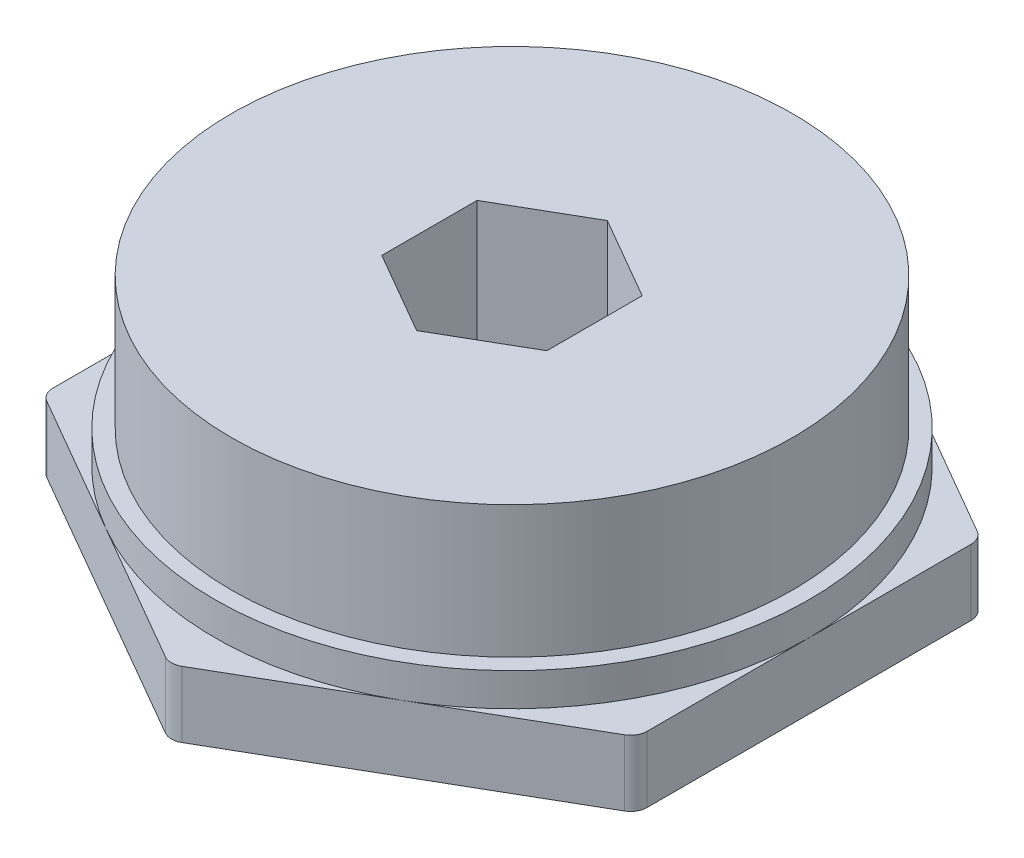
ISO-10303-21;
HEADER;
FILE_DESCRIPTION(('STEP AP214'),'2;1');
FILE_NAME('part.step','',(''),(''),'','','');
FILE_SCHEMA(('AUTOMOTIVE_DESIGN { 1 0 10303 214 1 1 1 1 }'));
ENDSEC;
DATA;
#1=APPLICATION_CONTEXT('core data for automotive mechanical design processes');
#2=APPLICATION_PROTOCOL_DEFINITION('international standard','automotive_design',2000,#1);
#3=PRODUCT_CONTEXT('',#1,'mechanical');
#4=PRODUCT('Part','Part','',(#3));
#5=PRODUCT_RELATED_PRODUCT_CATEGORY('part','',(#4));
#6=PRODUCT_DEFINITION_FORMATION('','',#4);
#7=PRODUCT_DEFINITION_CONTEXT('part definition',#1,'design');
#8=PRODUCT_DEFINITION('design','',#6,#7);
#9=PRODUCT_DEFINITION_SHAPE('','',#8);
#10=(LENGTH_UNIT() NAMED_UNIT(*) SI_UNIT(.MILLI.,.METRE.));
#11=(NAMED_UNIT(*) PLANE_ANGLE_UNIT() SI_UNIT($,.RADIAN.));
#12=(NAMED_UNIT(*) SI_UNIT($,.STERADIAN.) SOLID_ANGLE_UNIT());
#13=UNCERTAINTY_MEASURE_WITH_UNIT(LENGTH_MEASURE(1.E-05),#10,'distance_accuracy_value','');
#14=(GEOMETRIC_REPRESENTATION_CONTEXT(3) GLOBAL_UNCERTAINTY_ASSIGNED_CONTEXT((#13)) GLOBAL_UNIT_ASSIGNED_CONTEXT((#10,
#11,#12)) REPRESENTATION_CONTEXT('',''));
#15=CARTESIAN_POINT('',(0.,0.,0.));
#16=DIRECTION('',(0.,0.,1.));
#17=DIRECTION('',(1.,0.,0.));
#18=AXIS2_PLACEMENT_3D('',#15,#16,#17);
#19=CARTESIAN_POINT('',(0.,33.,0.));
#20=DIRECTION('',(0.,1.,0.));
#21=DIRECTION('',(0.,0.,1.));
#22=AXIS2_PLACEMENT_3D('',#19,#20,#21);
#23=PLANE('',#22);
#24=CARTESIAN_POINT('',(0.,33.,0.));
#25=DIRECTION('',(0.,1.,0.));
#26=DIRECTION('',(0.,0.,1.));
#27=AXIS2_PLACEMENT_3D('',#24,#25,#26);
#28=CIRCLE('',#27,9.00000000000006);
#29=CARTESIAN_POINT('',(4.50000000000009,33.,7.79422863405996));
#30=VERTEX_POINT('',#29);
#31=CARTESIAN_POINT('',(8.99999999999999,33.,0.));
#32=VERTEX_POINT('',#31);
#33=EDGE_CURVE('E303',#30,#32,#28,.T.);
#34=ORIENTED_EDGE('',*,*,#33,.F.);
#35=DIRECTION('',(0.866025403784435,0.,-0.500000000000007));
#36=VECTOR('',#35,1.);
#37=CARTESIAN_POINT('',(0.,33.,10.3923048454133));
#38=LINE('',#37,#36);
#39=CARTESIAN_POINT('',(8.75000000000004,33.,5.34048999000395));
#40=VERTEX_POINT('',#39);
#41=EDGE_CURVE('E334',#30,#40,#38,.T.);
#42=ORIENTED_EDGE('',*,*,#41,.T.);
#43=CARTESIAN_POINT('',(8.50000000000004,33.,4.90747728811174));
#44=DIRECTION('',(0.,1.,0.));
#45=DIRECTION('',(0.,0.,1.));
#46=AXIS2_PLACEMENT_3D('',#43,#44,#45);
#47=CIRCLE('',#46,0.5);
#48=CARTESIAN_POINT('',(9.00000000000004,33.,4.90747728811173));
#49=VERTEX_POINT('',#48);
#50=EDGE_CURVE('E402',#40,#49,#47,.T.);
#51=ORIENTED_EDGE('',*,*,#50,.T.);
#52=DIRECTION('',(0.,0.,-1.));
#53=VECTOR('',#52,1.);
#54=CARTESIAN_POINT('',(9.00000000000004,33.,5.19615242270655));
#55=LINE('',#54,#53);
#56=EDGE_CURVE('E339',#49,#32,#55,.T.);
#57=ORIENTED_EDGE('',*,*,#56,.T.);
#58=EDGE_LOOP('',(#34,#42,#51,#57));
#59=FACE_BOUND('',#58,.T.);
#60=ADVANCED_FACE('F45',(#59),#23,.T.);
#61=CARTESIAN_POINT('',(4.49999999999997,33.,-7.79422863406));
#62=VERTEX_POINT('',#61);
#63=EDGE_CURVE('E55',#32,#62,#28,.T.);
#64=ORIENTED_EDGE('',*,*,#63,.F.);
#65=CARTESIAN_POINT('',(8.99999999999994,33.,-4.90747728811192));
#66=VERTEX_POINT('',#65);
#67=EDGE_CURVE('E338',#32,#66,#55,.T.);
#68=ORIENTED_EDGE('',*,*,#67,.T.);
#69=CARTESIAN_POINT('',(8.49999999999994,33.,-4.90747728811192));
#70=DIRECTION('',(0.,1.,0.));
#71=DIRECTION('',(0.,0.,1.));
#72=AXIS2_PLACEMENT_3D('',#69,#70,#71);
#73=CIRCLE('',#72,0.5);
#74=CARTESIAN_POINT('',(8.74999999999993,33.,-5.34048999000414));
#75=VERTEX_POINT('',#74);
#76=EDGE_CURVE('E399',#66,#75,#73,.T.);
#77=ORIENTED_EDGE('',*,*,#76,.T.);
#78=DIRECTION('',(-0.866025403784441,0.,-0.499999999999995));
#79=VECTOR('',#78,1.);
#80=CARTESIAN_POINT('',(8.99999999999993,33.,-5.19615242270673));
#81=LINE('',#80,#79);
#82=EDGE_CURVE('E314',#75,#62,#81,.T.);
#83=ORIENTED_EDGE('',*,*,#82,.T.);
#84=EDGE_LOOP('',(#64,#68,#77,#83));
#85=FACE_BOUND('',#84,.T.);
#86=ADVANCED_FACE('F471',(#85),#23,.T.);
#87=CARTESIAN_POINT('',(-4.50000000000001,33.,-7.79422863405994));
#88=VERTEX_POINT('',#87);
#89=EDGE_CURVE('E463',#62,#88,#28,.T.);
#90=ORIENTED_EDGE('',*,*,#89,.F.);
#91=CARTESIAN_POINT('',(0.25,33.,-10.2479672781159));
#92=VERTEX_POINT('',#91);
#93=EDGE_CURVE('E319',#62,#92,#81,.T.);
#94=ORIENTED_EDGE('',*,*,#93,.T.);
#95=CARTESIAN_POINT('',(0.,33.,-9.81495457622364));
#96=DIRECTION('',(0.,1.,0.));
#97=DIRECTION('',(0.,0.,1.));
#98=AXIS2_PLACEMENT_3D('',#95,#96,#97);
#99=CIRCLE('',#98,0.5);
#100=CARTESIAN_POINT('',(-0.249999999999997,33.,-10.2479672781159));
#101=VERTEX_POINT('',#100);
#102=EDGE_CURVE('E414',#92,#101,#99,.T.);
#103=ORIENTED_EDGE('',*,*,#102,.T.);
#104=DIRECTION('',(-0.866025403784438,0.,0.500000000000001));
#105=VECTOR('',#104,1.);
#106=CARTESIAN_POINT('',(0.,33.,-10.3923048454133));
#107=LINE('',#106,#105);
#108=EDGE_CURVE('E320',#101,#88,#107,.T.);
#109=ORIENTED_EDGE('',*,*,#108,.T.);
#110=EDGE_LOOP('',(#90,#94,#103,#109));
#111=FACE_BOUND('',#110,.T.);
#112=ADVANCED_FACE('F539',(#111),#23,.T.);
#113=CARTESIAN_POINT('',(-8.99999999999999,33.,0.));
#114=VERTEX_POINT('',#113);
#115=EDGE_CURVE('E459',#88,#114,#28,.T.);
#116=ORIENTED_EDGE('',*,*,#115,.F.);
#117=CARTESIAN_POINT('',(-8.75000000000001,33.,-5.34048999000402));
#118=VERTEX_POINT('',#117);
#119=EDGE_CURVE('E318',#88,#118,#107,.T.);
#120=ORIENTED_EDGE('',*,*,#119,.T.);
#121=CARTESIAN_POINT('',(-8.50000000000001,33.,-4.9074772881118));
#122=DIRECTION('',(0.,1.,0.));
#123=DIRECTION('',(0.,0.,1.));
#124=AXIS2_PLACEMENT_3D('',#121,#122,#123);
#125=CIRCLE('',#124,0.5);
#126=CARTESIAN_POINT('',(-9.00000000000001,33.,-4.90747728811179));
#127=VERTEX_POINT('',#126);
#128=EDGE_CURVE('E411',#118,#127,#125,.T.);
#129=ORIENTED_EDGE('',*,*,#128,.T.);
#130=DIRECTION('',(0.,0.,1.));
#131=VECTOR('',#130,1.);
#132=CARTESIAN_POINT('',(-9.00000000000001,33.,-5.19615242270661));
#133=LINE('',#132,#131);
#134=EDGE_CURVE('E325',#127,#114,#133,.T.);
#135=ORIENTED_EDGE('',*,*,#134,.T.);
#136=EDGE_LOOP('',(#116,#120,#129,#135));
#137=FACE_BOUND('',#136,.T.);
#138=ADVANCED_FACE('F552',(#137),#23,.T.);
#139=CARTESIAN_POINT('',(-4.49999999999995,33.,7.79422863405997));
#140=VERTEX_POINT('',#139);
#141=EDGE_CURVE('E454',#114,#140,#28,.T.);
#142=ORIENTED_EDGE('',*,*,#141,.F.);
#143=CARTESIAN_POINT('',(-8.99999999999998,33.,4.90747728811186));
#144=VERTEX_POINT('',#143);
#145=EDGE_CURVE('E324',#114,#144,#133,.T.);
#146=ORIENTED_EDGE('',*,*,#145,.T.);
#147=CARTESIAN_POINT('',(-8.49999999999998,33.,4.90747728811186));
#148=DIRECTION('',(0.,1.,0.));
#149=DIRECTION('',(0.,0.,1.));
#150=AXIS2_PLACEMENT_3D('',#147,#148,#149);
#151=CIRCLE('',#150,0.5);
#152=CARTESIAN_POINT('',(-8.74999999999997,33.,5.34048999000408));
#153=VERTEX_POINT('',#152);
#154=EDGE_CURVE('E408',#144,#153,#151,.T.);
#155=ORIENTED_EDGE('',*,*,#154,.T.);
#156=DIRECTION('',(0.866025403784442,0.,0.499999999999995));
#157=VECTOR('',#156,1.);
#158=CARTESIAN_POINT('',(-8.99999999999997,33.,5.19615242270667));
#159=LINE('',#158,#157);
#160=EDGE_CURVE('E330',#153,#140,#159,.T.);
#161=ORIENTED_EDGE('',*,*,#160,.T.);
#162=EDGE_LOOP('',(#142,#146,#155,#161));
#163=FACE_BOUND('',#162,.T.);
#164=ADVANCED_FACE('F543',(#163),#23,.T.);
#165=CARTESIAN_POINT('',(8.99999999999993,33.,-5.19615242270673));
#166=DIRECTION('',(-0.499999999999995,0.,0.866025403784441));
#167=DIRECTION('',(0.866025403784442,0.,0.499999999999995));
#168=AXIS2_PLACEMENT_3D('',#165,#166,#167);
#169=PLANE('',#168);
#170=DIRECTION('',(-0.866025403784441,0.,-0.499999999999995));
#171=VECTOR('',#170,1.);
#172=CARTESIAN_POINT('',(8.99999999999993,31.,-5.19615242270673));
#173=LINE('',#172,#171);
#174=CARTESIAN_POINT('',(8.74999999999993,31.,-5.34048999000414));
#175=VERTEX_POINT('',#174);
#176=CARTESIAN_POINT('',(0.25,31.,-10.2479672781159));
#177=VERTEX_POINT('',#176);
#178=EDGE_CURVE('E309',#175,#177,#173,.T.);
#179=ORIENTED_EDGE('',*,*,#178,.T.);
#180=DIRECTION('',(0.,-1.,0.));
#181=VECTOR('',#180,1.);
#182=CARTESIAN_POINT('',(0.25,33.,-10.2479672781159));
#183=LINE('',#182,#181);
#184=EDGE_CURVE('E395',#177,#92,#183,.F.);
#185=ORIENTED_EDGE('',*,*,#184,.T.);
#186=ORIENTED_EDGE('',*,*,#93,.F.);
#187=ORIENTED_EDGE('',*,*,#82,.F.);
#188=DIRECTION('',(0.,-1.,0.));
#189=VECTOR('',#188,1.);
#190=CARTESIAN_POINT('',(8.74999999999993,33.,-5.34048999000414));
#191=LINE('',#190,#189);
#192=EDGE_CURVE('E391',#75,#175,#191,.T.);
#193=ORIENTED_EDGE('',*,*,#192,.T.);
#194=EDGE_LOOP('',(#179,#185,#186,#187,#193));
#195=FACE_BOUND('',#194,.T.);
#196=ADVANCED_FACE('F521',(#195),#169,.F.);
#197=CARTESIAN_POINT('',(0.,33.,-10.3923048454133));
#198=DIRECTION('',(0.500000000000001,0.,0.866025403784438));
#199=DIRECTION('',(0.866025403784438,0.,-0.500000000000001));
#200=AXIS2_PLACEMENT_3D('',#197,#198,#199);
#201=PLANE('',#200);
#202=ORIENTED_EDGE('',*,*,#108,.F.);
#203=DIRECTION('',(0.,-1.,0.));
#204=VECTOR('',#203,1.);
#205=CARTESIAN_POINT('',(-0.249999999999997,33.,-10.2479672781159));
#206=LINE('',#205,#204);
#207=CARTESIAN_POINT('',(-0.249999999999997,31.,-10.2479672781159));
#208=VERTEX_POINT('',#207);
#209=EDGE_CURVE('E370',#101,#208,#206,.T.);
#210=ORIENTED_EDGE('',*,*,#209,.T.);
#211=DIRECTION('',(-0.866025403784438,0.,0.500000000000001));
#212=VECTOR('',#211,1.);
#213=CARTESIAN_POINT('',(0.,31.,-10.3923048454133));
#214=LINE('',#213,#212);
#215=CARTESIAN_POINT('',(-8.75000000000001,31.,-5.34048999000402));
#216=VERTEX_POINT('',#215);
#217=EDGE_CURVE('E347',#208,#216,#214,.T.);
#218=ORIENTED_EDGE('',*,*,#217,.T.);
#219=DIRECTION('',(0.,-1.,0.));
#220=VECTOR('',#219,1.);
#221=CARTESIAN_POINT('',(-8.75000000000001,33.,-5.34048999000402));
#222=LINE('',#221,#220);
#223=EDGE_CURVE('E343',#216,#118,#222,.F.);
#224=ORIENTED_EDGE('',*,*,#223,.T.);
#225=ORIENTED_EDGE('',*,*,#119,.F.);
#226=EDGE_LOOP('',(#202,#210,#218,#224,#225));
#227=FACE_BOUND('',#226,.T.);
#228=ADVANCED_FACE('F512',(#227),#201,.F.);
#229=CARTESIAN_POINT('',(-9.00000000000001,33.,-5.19615242270661));
#230=DIRECTION('',(1.,0.,0.));
#231=DIRECTION('',(0.,0.,-1.));
#232=AXIS2_PLACEMENT_3D('',#229,#230,#231);
#233=PLANE('',#232);
#234=ORIENTED_EDGE('',*,*,#134,.F.);
#235=DIRECTION('',(0.,-1.,0.));
#236=VECTOR('',#235,1.);
#237=CARTESIAN_POINT('',(-9.00000000000001,33.,-4.90747728811179));
#238=LINE('',#237,#236);
#239=CARTESIAN_POINT('',(-9.00000000000001,31.,-4.90747728811179));
#240=VERTEX_POINT('',#239);
#241=EDGE_CURVE('E421',#127,#240,#238,.T.);
#242=ORIENTED_EDGE('',*,*,#241,.T.);
#243=DIRECTION('',(0.,0.,1.));
#244=VECTOR('',#243,1.);
#245=CARTESIAN_POINT('',(-9.00000000000001,31.,-5.19615242270661));
#246=LINE('',#245,#244);
#247=CARTESIAN_POINT('',(-8.99999999999998,31.,4.90747728811186));
#248=VERTEX_POINT('',#247);
#249=EDGE_CURVE('E351',#240,#248,#246,.T.);
#250=ORIENTED_EDGE('',*,*,#249,.T.);
#251=DIRECTION('',(0.,-1.,0.));
#252=VECTOR('',#251,1.);
#253=CARTESIAN_POINT('',(-8.99999999999998,33.,4.90747728811186));
#254=LINE('',#253,#252);
#255=EDGE_CURVE('E417',#248,#144,#254,.F.);
#256=ORIENTED_EDGE('',*,*,#255,.T.);
#257=ORIENTED_EDGE('',*,*,#145,.F.);
#258=EDGE_LOOP('',(#234,#242,#250,#256,#257));
#259=FACE_BOUND('',#258,.T.);
#260=ADVANCED_FACE('F503',(#259),#233,.F.);
#261=CARTESIAN_POINT('',(-8.99999999999997,33.,5.19615242270667));
#262=DIRECTION('',(0.499999999999995,0.,-0.866025403784442));
#263=DIRECTION('',(-0.866025403784442,0.,-0.499999999999995));
#264=AXIS2_PLACEMENT_3D('',#261,#262,#263);
#265=PLANE('',#264);
#266=ORIENTED_EDGE('',*,*,#160,.F.);
#267=DIRECTION('',(0.,-1.,0.));
#268=VECTOR('',#267,1.);
#269=CARTESIAN_POINT('',(-8.74999999999997,33.,5.34048999000408));
#270=LINE('',#269,#268);
#271=CARTESIAN_POINT('',(-8.74999999999997,31.,5.34048999000408));
#272=VERTEX_POINT('',#271);
#273=EDGE_CURVE('E429',#153,#272,#270,.T.);
#274=ORIENTED_EDGE('',*,*,#273,.T.);
#275=DIRECTION('',(0.866025403784442,0.,0.499999999999995));
#276=VECTOR('',#275,1.);
#277=CARTESIAN_POINT('',(-8.99999999999997,31.,5.19615242270667));
#278=LINE('',#277,#276);
#279=CARTESIAN_POINT('',(-0.249999999999929,31.,10.2479672781159));
#280=VERTEX_POINT('',#279);
#281=EDGE_CURVE('E355',#272,#280,#278,.T.);
#282=ORIENTED_EDGE('',*,*,#281,.T.);
#283=DIRECTION('',(0.,-1.,0.));
#284=VECTOR('',#283,1.);
#285=CARTESIAN_POINT('',(-0.249999999999929,33.,10.2479672781159));
#286=LINE('',#285,#284);
#287=CARTESIAN_POINT('',(-0.249999999999929,33.,10.2479672781159));
#288=VERTEX_POINT('',#287);
#289=EDGE_CURVE('E425',#280,#288,#286,.F.);
#290=ORIENTED_EDGE('',*,*,#289,.T.);
#291=EDGE_CURVE('E329',#140,#288,#159,.T.);
#292=ORIENTED_EDGE('',*,*,#291,.F.);
#293=EDGE_LOOP('',(#266,#274,#282,#290,#292));
#294=FACE_BOUND('',#293,.T.);
#295=ADVANCED_FACE('F493',(#294),#265,.F.);
#296=CARTESIAN_POINT('',(0.,33.,10.3923048454133));
#297=DIRECTION('',(-0.500000000000007,0.,-0.866025403784435));
#298=DIRECTION('',(-0.866025403784435,0.,0.500000000000007));
#299=AXIS2_PLACEMENT_3D('',#296,#297,#298);
#300=PLANE('',#299);
#301=CARTESIAN_POINT('',(0.250000000000071,33.,10.2479672781158));
#302=VERTEX_POINT('',#301);
#303=EDGE_CURVE('E335',#302,#30,#38,.T.);
#304=ORIENTED_EDGE('',*,*,#303,.F.);
#305=DIRECTION('',(0.,-1.,0.));
#306=VECTOR('',#305,1.);
#307=CARTESIAN_POINT('',(0.250000000000071,33.,10.2479672781158));
#308=LINE('',#307,#306);
#309=CARTESIAN_POINT('',(0.250000000000071,31.,10.2479672781158));
#310=VERTEX_POINT('',#309);
#311=EDGE_CURVE('E437',#302,#310,#308,.T.);
#312=ORIENTED_EDGE('',*,*,#311,.T.);
#313=DIRECTION('',(0.866025403784435,0.,-0.500000000000007));
#314=VECTOR('',#313,1.);
#315=CARTESIAN_POINT('',(0.,31.,10.3923048454133));
#316=LINE('',#315,#314);
#317=CARTESIAN_POINT('',(8.75000000000004,31.,5.34048999000395));
#318=VERTEX_POINT('',#317);
#319=EDGE_CURVE('E359',#310,#318,#316,.T.);
#320=ORIENTED_EDGE('',*,*,#319,.T.);
#321=DIRECTION('',(0.,-1.,0.));
#322=VECTOR('',#321,1.);
#323=CARTESIAN_POINT('',(8.75000000000004,33.,5.34048999000395));
#324=LINE('',#323,#322);
#325=EDGE_CURVE('E433',#318,#40,#324,.F.);
#326=ORIENTED_EDGE('',*,*,#325,.T.);
#327=ORIENTED_EDGE('',*,*,#41,.F.);
#328=EDGE_LOOP('',(#304,#312,#320,#326,#327));
#329=FACE_BOUND('',#328,.T.);
#330=ADVANCED_FACE('F484',(#329),#300,.F.);
#331=CARTESIAN_POINT('',(9.00000000000004,33.,5.19615242270655));
#332=DIRECTION('',(-1.,0.,0.));
#333=DIRECTION('',(0.,0.,1.));
#334=AXIS2_PLACEMENT_3D('',#331,#332,#333);
#335=PLANE('',#334);
#336=ORIENTED_EDGE('',*,*,#56,.F.);
#337=DIRECTION('',(0.,-1.,0.));
#338=VECTOR('',#337,1.);
#339=CARTESIAN_POINT('',(9.00000000000004,33.,4.90747728811173));
#340=LINE('',#339,#338);
#341=CARTESIAN_POINT('',(9.00000000000004,31.,4.90747728811173));
#342=VERTEX_POINT('',#341);
#343=EDGE_CURVE('E49',#49,#342,#340,.T.);
#344=ORIENTED_EDGE('',*,*,#343,.T.);
#345=DIRECTION('',(0.,0.,-1.));
#346=VECTOR('',#345,1.);
#347=CARTESIAN_POINT('',(9.00000000000004,31.,5.19615242270655));
#348=LINE('',#347,#346);
#349=CARTESIAN_POINT('',(8.99999999999994,31.,-4.90747728811192));
#350=VERTEX_POINT('',#349);
#351=EDGE_CURVE('E363',#342,#350,#348,.T.);
#352=ORIENTED_EDGE('',*,*,#351,.T.);
#353=DIRECTION('',(0.,-1.,0.));
#354=VECTOR('',#353,1.);
#355=CARTESIAN_POINT('',(8.99999999999994,33.,-4.90747728811192));
#356=LINE('',#355,#354);
#357=EDGE_CURVE('E440',#350,#66,#356,.F.);
#358=ORIENTED_EDGE('',*,*,#357,.T.);
#359=ORIENTED_EDGE('',*,*,#67,.F.);
#360=EDGE_LOOP('',(#336,#344,#352,#358,#359));
#361=FACE_BOUND('',#360,.T.);
#362=ADVANCED_FACE('F473',(#361),#335,.F.);
#363=EDGE_CURVE('E313',#140,#30,#28,.T.);
#364=ORIENTED_EDGE('',*,*,#363,.F.);
#365=ORIENTED_EDGE('',*,*,#291,.T.);
#366=CARTESIAN_POINT('',(0.,33.,9.81495457622363));
#367=DIRECTION('',(0.,1.,0.));
#368=DIRECTION('',(0.,0.,1.));
#369=AXIS2_PLACEMENT_3D('',#366,#367,#368);
#370=CIRCLE('',#369,0.5);
#371=EDGE_CURVE('E405',#288,#302,#370,.T.);
#372=ORIENTED_EDGE('',*,*,#371,.T.);
#373=ORIENTED_EDGE('',*,*,#303,.T.);
#374=EDGE_LOOP('',(#364,#365,#372,#373));
#375=FACE_BOUND('',#374,.T.);
#376=ADVANCED_FACE('F536',(#375),#23,.T.);
#377=CARTESIAN_POINT('',(0.,31.,0.));
#378=DIRECTION('',(0.,1.,0.));
#379=DIRECTION('',(0.,0.,1.));
#380=AXIS2_PLACEMENT_3D('',#377,#378,#379);
#381=PLANE('',#380);
#382=DIRECTION('',(0.,0.,-1.));
#383=VECTOR('',#382,1.);
#384=CARTESIAN_POINT('',(2.5,31.,1.44337567297406));
#385=LINE('',#384,#383);
#386=CARTESIAN_POINT('',(2.5,31.,1.44337567297406));
#387=VERTEX_POINT('',#386);
#388=CARTESIAN_POINT('',(2.5,31.,-1.44337567297407));
#389=VERTEX_POINT('',#388);
#390=EDGE_CURVE('E239',#387,#389,#385,.T.);
#391=ORIENTED_EDGE('',*,*,#390,.T.);
#392=DIRECTION('',(-0.866025403784439,0.,-0.5));
#393=VECTOR('',#392,1.);
#394=CARTESIAN_POINT('',(2.5,31.,-1.44337567297407));
#395=LINE('',#394,#393);
#396=CARTESIAN_POINT('',(0.,31.,-2.88675134594813));
#397=VERTEX_POINT('',#396);
#398=EDGE_CURVE('E232',#389,#397,#395,.T.);
#399=ORIENTED_EDGE('',*,*,#398,.T.);
#400=DIRECTION('',(-0.866025403784439,0.,0.5));
#401=VECTOR('',#400,1.);
#402=CARTESIAN_POINT('',(0.,31.,-2.88675134594813));
#403=LINE('',#402,#401);
#404=CARTESIAN_POINT('',(-2.5,31.,-1.44337567297406));
#405=VERTEX_POINT('',#404);
#406=EDGE_CURVE('E242',#397,#405,#403,.T.);
#407=ORIENTED_EDGE('',*,*,#406,.T.);
#408=DIRECTION('',(0.,0.,1.));
#409=VECTOR('',#408,1.);
#410=CARTESIAN_POINT('',(-2.5,31.,-1.44337567297406));
#411=LINE('',#410,#409);
#412=CARTESIAN_POINT('',(-2.5,31.,1.44337567297407));
#413=VERTEX_POINT('',#412);
#414=EDGE_CURVE('E66',#405,#413,#411,.T.);
#415=ORIENTED_EDGE('',*,*,#414,.T.);
#416=DIRECTION('',(0.866025403784439,0.,0.5));
#417=VECTOR('',#416,1.);
#418=CARTESIAN_POINT('',(-2.5,31.,1.44337567297407));
#419=LINE('',#418,#417);
#420=CARTESIAN_POINT('',(0.,31.,2.88675134594813));
#421=VERTEX_POINT('',#420);
#422=EDGE_CURVE('E263',#413,#421,#419,.T.);
#423=ORIENTED_EDGE('',*,*,#422,.T.);
#424=DIRECTION('',(0.866025403784439,0.,-0.5));
#425=VECTOR('',#424,1.);
#426=CARTESIAN_POINT('',(0.,31.,2.88675134594813));
#427=LINE('',#426,#425);
#428=EDGE_CURVE('E267',#421,#387,#427,.T.);
#429=ORIENTED_EDGE('',*,*,#428,.T.);
#430=EDGE_LOOP('',(#391,#399,#407,#415,#423,#429));
#431=FACE_BOUND('',#430,.T.);
#432=ORIENTED_EDGE('',*,*,#217,.F.);
#433=CARTESIAN_POINT('',(0.,31.,-9.81495457622364));
#434=DIRECTION('',(0.,1.,0.));
#435=DIRECTION('',(0.,0.,1.));
#436=AXIS2_PLACEMENT_3D('',#433,#434,#435);
#437=CIRCLE('',#436,0.5);
#438=EDGE_CURVE('E388',#208,#177,#437,.F.);
#439=ORIENTED_EDGE('',*,*,#438,.T.);
#440=ORIENTED_EDGE('',*,*,#178,.F.);
#441=CARTESIAN_POINT('',(8.49999999999994,31.,-4.90747728811192));
#442=DIRECTION('',(0.,1.,0.));
#443=DIRECTION('',(0.,0.,1.));
#444=AXIS2_PLACEMENT_3D('',#441,#442,#443);
#445=CIRCLE('',#444,0.5);
#446=EDGE_CURVE('E374',#175,#350,#445,.F.);
#447=ORIENTED_EDGE('',*,*,#446,.T.);
#448=ORIENTED_EDGE('',*,*,#351,.F.);
#449=CARTESIAN_POINT('',(8.50000000000004,31.,4.90747728811174));
#450=DIRECTION('',(0.,1.,0.));
#451=DIRECTION('',(0.,0.,1.));
#452=AXIS2_PLACEMENT_3D('',#449,#450,#451);
#453=CIRCLE('',#452,0.5);
#454=EDGE_CURVE('E377',#342,#318,#453,.F.);
#455=ORIENTED_EDGE('',*,*,#454,.T.);
#456=ORIENTED_EDGE('',*,*,#319,.F.);
#457=CARTESIAN_POINT('',(0.,31.,9.81495457622363));
#458=DIRECTION('',(0.,1.,0.));
#459=DIRECTION('',(0.,0.,1.));
#460=AXIS2_PLACEMENT_3D('',#457,#458,#459);
#461=CIRCLE('',#460,0.5);
#462=EDGE_CURVE('E379',#310,#280,#461,.F.);
#463=ORIENTED_EDGE('',*,*,#462,.T.);
#464=ORIENTED_EDGE('',*,*,#281,.F.);
#465=CARTESIAN_POINT('',(-8.49999999999998,31.,4.90747728811186));
#466=DIRECTION('',(0.,1.,0.));
#467=DIRECTION('',(0.,0.,1.));
#468=AXIS2_PLACEMENT_3D('',#465,#466,#467);
#469=CIRCLE('',#468,0.5);
#470=EDGE_CURVE('E382',#272,#248,#469,.F.);
#471=ORIENTED_EDGE('',*,*,#470,.T.);
#472=ORIENTED_EDGE('',*,*,#249,.F.);
#473=CARTESIAN_POINT('',(-8.50000000000001,31.,-4.9074772881118));
#474=DIRECTION('',(0.,1.,0.));
#475=DIRECTION('',(0.,0.,1.));
#476=AXIS2_PLACEMENT_3D('',#473,#474,#475);
#477=CIRCLE('',#476,0.5);
#478=EDGE_CURVE('E385',#240,#216,#477,.F.);
#479=ORIENTED_EDGE('',*,*,#478,.T.);
#480=EDGE_LOOP('',(#432,#439,#440,#447,#448,#455,#456,#463,#464,#471,#472,#479));
#481=FACE_BOUND('',#480,.T.);
#482=ADVANCED_FACE('F247',(#431,#481),#381,.F.);
#483=CARTESIAN_POINT('',(0.,33.,-9.81495457622364));
#484=DIRECTION('',(0.,-1.,0.));
#485=DIRECTION('',(0.,0.,-1.));
#486=AXIS2_PLACEMENT_3D('',#483,#484,#485);
#487=CYLINDRICAL_SURFACE('',#486,0.5);
#488=ORIENTED_EDGE('',*,*,#102,.F.);
#489=ORIENTED_EDGE('',*,*,#184,.F.);
#490=ORIENTED_EDGE('',*,*,#438,.F.);
#491=ORIENTED_EDGE('',*,*,#209,.F.);
#492=EDGE_LOOP('',(#488,#489,#490,#491));
#493=FACE_BOUND('',#492,.T.);
#494=ADVANCED_FACE('F517',(#493),#487,.T.);
#495=CARTESIAN_POINT('',(-8.50000000000001,33.,-4.9074772881118));
#496=DIRECTION('',(0.,-1.,0.));
#497=DIRECTION('',(0.,0.,-1.));
#498=AXIS2_PLACEMENT_3D('',#495,#496,#497);
#499=CYLINDRICAL_SURFACE('',#498,0.5);
#500=ORIENTED_EDGE('',*,*,#128,.F.);
#501=ORIENTED_EDGE('',*,*,#223,.F.);
#502=ORIENTED_EDGE('',*,*,#478,.F.);
#503=ORIENTED_EDGE('',*,*,#241,.F.);
#504=EDGE_LOOP('',(#500,#501,#502,#503));
#505=FACE_BOUND('',#504,.T.);
#506=ADVANCED_FACE('F508',(#505),#499,.T.);
#507=CARTESIAN_POINT('',(-8.49999999999998,33.,4.90747728811186));
#508=DIRECTION('',(0.,-1.,0.));
#509=DIRECTION('',(0.,0.,-1.));
#510=AXIS2_PLACEMENT_3D('',#507,#508,#509);
#511=CYLINDRICAL_SURFACE('',#510,0.5);
#512=ORIENTED_EDGE('',*,*,#154,.F.);
#513=ORIENTED_EDGE('',*,*,#255,.F.);
#514=ORIENTED_EDGE('',*,*,#470,.F.);
#515=ORIENTED_EDGE('',*,*,#273,.F.);
#516=EDGE_LOOP('',(#512,#513,#514,#515));
#517=FACE_BOUND('',#516,.T.);
#518=ADVANCED_FACE('F498',(#517),#511,.T.);
#519=CARTESIAN_POINT('',(0.,33.,9.81495457622363));
#520=DIRECTION('',(0.,-1.,0.));
#521=DIRECTION('',(0.,0.,-1.));
#522=AXIS2_PLACEMENT_3D('',#519,#520,#521);
#523=CYLINDRICAL_SURFACE('',#522,0.5);
#524=ORIENTED_EDGE('',*,*,#371,.F.);
#525=ORIENTED_EDGE('',*,*,#289,.F.);
#526=ORIENTED_EDGE('',*,*,#462,.F.);
#527=ORIENTED_EDGE('',*,*,#311,.F.);
#528=EDGE_LOOP('',(#524,#525,#526,#527));
#529=FACE_BOUND('',#528,.T.);
#530=ADVANCED_FACE('F488',(#529),#523,.T.);
#531=CARTESIAN_POINT('',(8.50000000000004,33.,4.90747728811174));
#532=DIRECTION('',(0.,-1.,0.));
#533=DIRECTION('',(0.,0.,-1.));
#534=AXIS2_PLACEMENT_3D('',#531,#532,#533);
#535=CYLINDRICAL_SURFACE('',#534,0.5);
#536=ORIENTED_EDGE('',*,*,#50,.F.);
#537=ORIENTED_EDGE('',*,*,#325,.F.);
#538=ORIENTED_EDGE('',*,*,#454,.F.);
#539=ORIENTED_EDGE('',*,*,#343,.F.);
#540=EDGE_LOOP('',(#536,#537,#538,#539));
#541=FACE_BOUND('',#540,.T.);
#542=ADVANCED_FACE('F479',(#541),#535,.T.);
#543=CARTESIAN_POINT('',(8.49999999999994,33.,-4.90747728811192));
#544=DIRECTION('',(0.,-1.,0.));
#545=DIRECTION('',(0.,0.,-1.));
#546=AXIS2_PLACEMENT_3D('',#543,#544,#545);
#547=CYLINDRICAL_SURFACE('',#546,0.5);
#548=ORIENTED_EDGE('',*,*,#76,.F.);
#549=ORIENTED_EDGE('',*,*,#357,.F.);
#550=ORIENTED_EDGE('',*,*,#446,.F.);
#551=ORIENTED_EDGE('',*,*,#192,.F.);
#552=EDGE_LOOP('',(#548,#549,#550,#551));
#553=FACE_BOUND('',#552,.T.);
#554=ADVANCED_FACE('F47',(#553),#547,.T.);
#555=CARTESIAN_POINT('',(0.,34.,0.));
#556=DIRECTION('',(0.,-1.,0.));
#557=DIRECTION('',(0.,0.,-1.));
#558=AXIS2_PLACEMENT_3D('',#555,#556,#557);
#559=CYLINDRICAL_SURFACE('',#558,9.00000000000006);
#560=CARTESIAN_POINT('',(0.,34.,0.));
#561=DIRECTION('',(0.,1.,0.));
#562=DIRECTION('',(0.,0.,1.));
#563=AXIS2_PLACEMENT_3D('',#560,#561,#562);
#564=CIRCLE('',#563,9.00000000000006);
#565=CARTESIAN_POINT('',(0.,34.,9.00000000000006));
#566=VERTEX_POINT('',#565);
#567=EDGE_CURVE('E305',#566,#566,#564,.T.);
#568=ORIENTED_EDGE('',*,*,#567,.F.);
#569=EDGE_LOOP('',(#568));
#570=FACE_BOUND('',#569,.T.);
#571=ORIENTED_EDGE('',*,*,#33,.T.);
#572=ORIENTED_EDGE('',*,*,#63,.T.);
#573=ORIENTED_EDGE('',*,*,#89,.T.);
#574=ORIENTED_EDGE('',*,*,#115,.T.);
#575=ORIENTED_EDGE('',*,*,#141,.T.);
#576=ORIENTED_EDGE('',*,*,#363,.T.);
#577=EDGE_LOOP('',(#571,#572,#573,#574,#575,#576));
#578=FACE_BOUND('',#577,.T.);
#579=ADVANCED_FACE('F468',(#570,#578),#559,.T.);
#580=CARTESIAN_POINT('',(0.,34.,0.));
#581=DIRECTION('',(0.,1.,0.));
#582=DIRECTION('',(0.,0.,1.));
#583=AXIS2_PLACEMENT_3D('',#580,#581,#582);
#584=PLANE('',#583);
#585=CARTESIAN_POINT('',(0.,34.,0.));
#586=DIRECTION('',(0.,1.,0.));
#587=DIRECTION('',(0.,0.,1.));
#588=AXIS2_PLACEMENT_3D('',#585,#586,#587);
#589=CIRCLE('',#588,8.5);
#590=CARTESIAN_POINT('',(0.,34.,8.5));
#591=VERTEX_POINT('',#590);
#592=EDGE_CURVE('E11',#591,#591,#589,.T.);
#593=ORIENTED_EDGE('',*,*,#592,.F.);
#594=EDGE_LOOP('',(#593));
#595=FACE_BOUND('',#594,.T.);
#596=ORIENTED_EDGE('',*,*,#567,.T.);
#597=EDGE_LOOP('',(#596));
#598=FACE_BOUND('',#597,.T.);
#599=ADVANCED_FACE('F531',(#595,#598),#584,.T.);
#600=CARTESIAN_POINT('',(0.,38.,0.));
#601=DIRECTION('',(0.,-1.,0.));
#602=DIRECTION('',(0.,0.,-1.));
#603=AXIS2_PLACEMENT_3D('',#600,#601,#602);
#604=CYLINDRICAL_SURFACE('',#603,8.5);
#605=CARTESIAN_POINT('',(0.,38.,0.));
#606=DIRECTION('',(0.,1.,0.));
#607=DIRECTION('',(0.,0.,1.));
#608=AXIS2_PLACEMENT_3D('',#605,#606,#607);
#609=CIRCLE('',#608,8.5);
#610=CARTESIAN_POINT('',(0.,38.,8.5));
#611=VERTEX_POINT('',#610);
#612=EDGE_CURVE('E291',#611,#611,#609,.T.);
#613=ORIENTED_EDGE('',*,*,#612,.F.);
#614=EDGE_LOOP('',(#613));
#615=FACE_BOUND('',#614,.T.);
#616=ORIENTED_EDGE('',*,*,#592,.T.);
#617=EDGE_LOOP('',(#616));
#618=FACE_BOUND('',#617,.T.);
#619=ADVANCED_FACE('F688',(#615,#618),#604,.T.);
#620=CARTESIAN_POINT('',(0.,38.,0.));
#621=DIRECTION('',(0.,1.,0.));
#622=DIRECTION('',(0.,0.,1.));
#623=AXIS2_PLACEMENT_3D('',#620,#621,#622);
#624=PLANE('',#623);
#625=DIRECTION('',(-0.866025403784439,0.,-0.5));
#626=VECTOR('',#625,1.);
#627=CARTESIAN_POINT('',(2.5,38.,-1.44337567297407));
#628=LINE('',#627,#626);
#629=CARTESIAN_POINT('',(2.5,38.,-1.44337567297407));
#630=VERTEX_POINT('',#629);
#631=CARTESIAN_POINT('',(0.,38.,-2.88675134594813));
#632=VERTEX_POINT('',#631);
#633=EDGE_CURVE('E77',#630,#632,#628,.T.);
#634=ORIENTED_EDGE('',*,*,#633,.F.);
#635=DIRECTION('',(0.,0.,-1.));
#636=VECTOR('',#635,1.);
#637=CARTESIAN_POINT('',(2.5,38.,1.44337567297406));
#638=LINE('',#637,#636);
#639=CARTESIAN_POINT('',(2.5,38.,1.44337567297406));
#640=VERTEX_POINT('',#639);
#641=EDGE_CURVE('E252',#640,#630,#638,.T.);
#642=ORIENTED_EDGE('',*,*,#641,.F.);
#643=DIRECTION('',(0.866025403784439,0.,-0.5));
#644=VECTOR('',#643,1.);
#645=CARTESIAN_POINT('',(0.,38.,2.88675134594813));
#646=LINE('',#645,#644);
#647=CARTESIAN_POINT('',(0.,38.,2.88675134594813));
#648=VERTEX_POINT('',#647);
#649=EDGE_CURVE('E258',#648,#640,#646,.T.);
#650=ORIENTED_EDGE('',*,*,#649,.F.);
#651=DIRECTION('',(0.866025403784439,0.,0.5));
#652=VECTOR('',#651,1.);
#653=CARTESIAN_POINT('',(-2.5,38.,1.44337567297407));
#654=LINE('',#653,#652);
#655=CARTESIAN_POINT('',(-2.5,38.,1.44337567297407));
#656=VERTEX_POINT('',#655);
#657=EDGE_CURVE('E281',#656,#648,#654,.T.);
#658=ORIENTED_EDGE('',*,*,#657,.F.);
#659=DIRECTION('',(0.,0.,1.));
#660=VECTOR('',#659,1.);
#661=CARTESIAN_POINT('',(-2.5,38.,-1.44337567297406));
#662=LINE('',#661,#660);
#663=CARTESIAN_POINT('',(-2.5,38.,-1.44337567297406));
#664=VERTEX_POINT('',#663);
#665=EDGE_CURVE('E277',#664,#656,#662,.T.);
#666=ORIENTED_EDGE('',*,*,#665,.F.);
#667=DIRECTION('',(-0.866025403784439,0.,0.5));
#668=VECTOR('',#667,1.);
#669=CARTESIAN_POINT('',(0.,38.,-2.88675134594813));
#670=LINE('',#669,#668);
#671=EDGE_CURVE('E274',#632,#664,#670,.T.);
#672=ORIENTED_EDGE('',*,*,#671,.F.);
#673=EDGE_LOOP('',(#634,#642,#650,#658,#666,#672));
#674=FACE_BOUND('',#673,.T.);
#675=ORIENTED_EDGE('',*,*,#612,.T.);
#676=EDGE_LOOP('',(#675));
#677=FACE_BOUND('',#676,.T.);
#678=ADVANCED_FACE('F681',(#674,#677),#624,.T.);
#679=CARTESIAN_POINT('',(2.5,31.,-1.44337567297407));
#680=DIRECTION('',(0.5,0.,-0.866025403784439));
#681=DIRECTION('',(-0.866025403784439,0.,-0.5));
#682=AXIS2_PLACEMENT_3D('',#679,#680,#681);
#683=PLANE('',#682);
#684=ORIENTED_EDGE('',*,*,#633,.T.);
#685=DIRECTION('',(0.,1.,0.));
#686=VECTOR('',#685,1.);
#687=CARTESIAN_POINT('',(0.,31.,-2.88675134594813));
#688=LINE('',#687,#686);
#689=EDGE_CURVE('E228',#397,#632,#688,.T.);
#690=ORIENTED_EDGE('',*,*,#689,.F.);
#691=ORIENTED_EDGE('',*,*,#398,.F.);
#692=DIRECTION('',(0.,1.,0.));
#693=VECTOR('',#692,1.);
#694=CARTESIAN_POINT('',(2.5,31.,-1.44337567297407));
#695=LINE('',#694,#693);
#696=EDGE_CURVE('E288',#389,#630,#695,.T.);
#697=ORIENTED_EDGE('',*,*,#696,.T.);
#698=EDGE_LOOP('',(#684,#690,#691,#697));
#699=FACE_BOUND('',#698,.T.);
#700=ADVANCED_FACE('F230',(#699),#683,.F.);
#701=CARTESIAN_POINT('',(2.5,31.,1.44337567297406));
#702=DIRECTION('',(1.,0.,0.));
#703=DIRECTION('',(0.,0.,-1.));
#704=AXIS2_PLACEMENT_3D('',#701,#702,#703);
#705=PLANE('',#704);
#706=ORIENTED_EDGE('',*,*,#641,.T.);
#707=ORIENTED_EDGE('',*,*,#696,.F.);
#708=ORIENTED_EDGE('',*,*,#390,.F.);
#709=DIRECTION('',(0.,1.,0.));
#710=VECTOR('',#709,1.);
#711=CARTESIAN_POINT('',(2.5,31.,1.44337567297406));
#712=LINE('',#711,#710);
#713=EDGE_CURVE('E292',#387,#640,#712,.T.);
#714=ORIENTED_EDGE('',*,*,#713,.T.);
#715=EDGE_LOOP('',(#706,#707,#708,#714));
#716=FACE_BOUND('',#715,.T.);
#717=ADVANCED_FACE('F626',(#716),#705,.F.);
#718=CARTESIAN_POINT('',(0.,31.,2.88675134594813));
#719=DIRECTION('',(0.5,0.,0.866025403784439));
#720=DIRECTION('',(0.866025403784439,0.,-0.5));
#721=AXIS2_PLACEMENT_3D('',#718,#719,#720);
#722=PLANE('',#721);
#723=ORIENTED_EDGE('',*,*,#649,.T.);
#724=ORIENTED_EDGE('',*,*,#713,.F.);
#725=ORIENTED_EDGE('',*,*,#428,.F.);
#726=DIRECTION('',(0.,1.,0.));
#727=VECTOR('',#726,1.);
#728=CARTESIAN_POINT('',(0.,31.,2.88675134594813));
#729=LINE('',#728,#727);
#730=EDGE_CURVE('E295',#421,#648,#729,.T.);
#731=ORIENTED_EDGE('',*,*,#730,.T.);
#732=EDGE_LOOP('',(#723,#724,#725,#731));
#733=FACE_BOUND('',#732,.T.);
#734=ADVANCED_FACE('F628',(#733),#722,.F.);
#735=CARTESIAN_POINT('',(-2.5,31.,1.44337567297407));
#736=DIRECTION('',(-0.5,0.,0.866025403784439));
#737=DIRECTION('',(0.866025403784439,0.,0.5));
#738=AXIS2_PLACEMENT_3D('',#735,#736,#737);
#739=PLANE('',#738);
#740=ORIENTED_EDGE('',*,*,#657,.T.);
#741=ORIENTED_EDGE('',*,*,#730,.F.);
#742=ORIENTED_EDGE('',*,*,#422,.F.);
#743=DIRECTION('',(0.,1.,0.));
#744=VECTOR('',#743,1.);
#745=CARTESIAN_POINT('',(-2.5,31.,1.44337567297407));
#746=LINE('',#745,#744);
#747=EDGE_CURVE('E297',#413,#656,#746,.T.);
#748=ORIENTED_EDGE('',*,*,#747,.T.);
#749=EDGE_LOOP('',(#740,#741,#742,#748));
#750=FACE_BOUND('',#749,.T.);
#751=ADVANCED_FACE('F644',(#750),#739,.F.);
#752=CARTESIAN_POINT('',(-2.5,31.,-1.44337567297406));
#753=DIRECTION('',(-1.,0.,0.));
#754=DIRECTION('',(0.,0.,1.));
#755=AXIS2_PLACEMENT_3D('',#752,#753,#754);
#756=PLANE('',#755);
#757=ORIENTED_EDGE('',*,*,#665,.T.);
#758=ORIENTED_EDGE('',*,*,#747,.F.);
#759=ORIENTED_EDGE('',*,*,#414,.F.);
#760=DIRECTION('',(0.,1.,0.));
#761=VECTOR('',#760,1.);
#762=CARTESIAN_POINT('',(-2.5,31.,-1.44337567297406));
#763=LINE('',#762,#761);
#764=EDGE_CURVE('E238',#405,#664,#763,.T.);
#765=ORIENTED_EDGE('',*,*,#764,.T.);
#766=EDGE_LOOP('',(#757,#758,#759,#765));
#767=FACE_BOUND('',#766,.T.);
#768=ADVANCED_FACE('F653',(#767),#756,.F.);
#769=CARTESIAN_POINT('',(0.,31.,-2.88675134594813));
#770=DIRECTION('',(-0.5,0.,-0.866025403784439));
#771=DIRECTION('',(-0.866025403784439,0.,0.5));
#772=AXIS2_PLACEMENT_3D('',#769,#770,#771);
#773=PLANE('',#772);
#774=ORIENTED_EDGE('',*,*,#671,.T.);
#775=ORIENTED_EDGE('',*,*,#764,.F.);
#776=ORIENTED_EDGE('',*,*,#406,.F.);
#777=ORIENTED_EDGE('',*,*,#689,.T.);
#778=EDGE_LOOP('',(#774,#775,#776,#777));
#779=FACE_BOUND('',#778,.T.);
#780=ADVANCED_FACE('F243',(#779),#773,.F.);
#781=CLOSED_SHELL('',(#60,#86,#112,#138,#164,#196,#228,#260,#295,#330,#362,#376,#482,#494,#506,
#518,#530,#542,#554,#579,#599,#619,#678,#700,#717,#734,#751,#768,#780));
#782=MANIFOLD_SOLID_BREP('B2',#781);
#783=ADVANCED_BREP_SHAPE_REPRESENTATION('',(#18,#782),#14);
#784=SHAPE_DEFINITION_REPRESENTATION(#9,#783);
ENDSEC;
END-ISO-10303-21;
